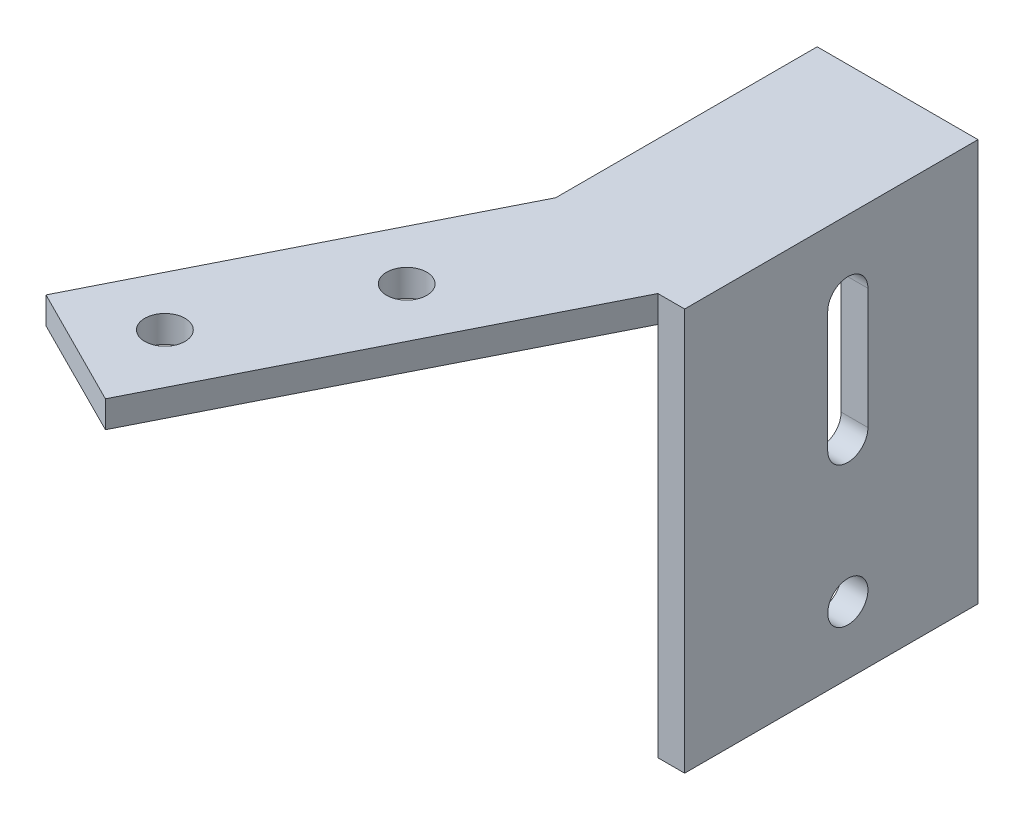
ISO-10303-21;
HEADER;
FILE_DESCRIPTION(('STEP AP214'),'2;1');
FILE_NAME('part.step','',(''),(''),'','','');
FILE_SCHEMA(('AUTOMOTIVE_DESIGN { 1 0 10303 214 1 1 1 1 }'));
ENDSEC;
DATA;
#1=APPLICATION_CONTEXT('core data for automotive mechanical design processes');
#2=APPLICATION_PROTOCOL_DEFINITION('international standard','automotive_design',2000,#1);
#3=PRODUCT_CONTEXT('',#1,'mechanical');
#4=PRODUCT('Part','Part','',(#3));
#5=PRODUCT_RELATED_PRODUCT_CATEGORY('part','',(#4));
#6=PRODUCT_DEFINITION_FORMATION('','',#4);
#7=PRODUCT_DEFINITION_CONTEXT('part definition',#1,'design');
#8=PRODUCT_DEFINITION('design','',#6,#7);
#9=PRODUCT_DEFINITION_SHAPE('','',#8);
#10=(LENGTH_UNIT() NAMED_UNIT(*) SI_UNIT(.MILLI.,.METRE.));
#11=(NAMED_UNIT(*) PLANE_ANGLE_UNIT() SI_UNIT($,.RADIAN.));
#12=(NAMED_UNIT(*) SI_UNIT($,.STERADIAN.) SOLID_ANGLE_UNIT());
#13=UNCERTAINTY_MEASURE_WITH_UNIT(LENGTH_MEASURE(1.E-05),#10,'distance_accuracy_value','');
#14=(GEOMETRIC_REPRESENTATION_CONTEXT(3) GLOBAL_UNCERTAINTY_ASSIGNED_CONTEXT((#13)) GLOBAL_UNIT_ASSIGNED_CONTEXT((#10,
#11,#12)) REPRESENTATION_CONTEXT('',''));
#15=CARTESIAN_POINT('',(0.,0.,0.));
#16=DIRECTION('',(0.,0.,1.));
#17=DIRECTION('',(1.,0.,0.));
#18=AXIS2_PLACEMENT_3D('',#15,#16,#17);
#19=CARTESIAN_POINT('',(-4.43914577172342,2.,-2.23557077949795));
#20=DIRECTION('',(-0.893136002999645,0.,-0.449786705167925));
#21=DIRECTION('',(-0.449786705167925,0.,0.893136002999645));
#22=AXIS2_PLACEMENT_3D('',#19,#20,#21);
#23=PLANE('',#22);
#24=DIRECTION('',(0.449786705167925,0.,-0.893136002999645));
#25=VECTOR('',#24,1.);
#26=CARTESIAN_POINT('',(-4.43914577172342,0.,-2.23557077949795));
#27=LINE('',#26,#25);
#28=CARTESIAN_POINT('',(-12.7192165328537,0.,14.2060652652784));
#29=VERTEX_POINT('',#28);
#30=CARTESIAN_POINT('',(0.0185649749016277,0.,-11.0871929217817));
#31=VERTEX_POINT('',#30);
#32=EDGE_CURVE('E223',#29,#31,#27,.T.);
#33=ORIENTED_EDGE('',*,*,#32,.F.);
#34=DIRECTION('',(0.,-1.,0.));
#35=VECTOR('',#34,1.);
#36=CARTESIAN_POINT('',(-12.7192165328537,2.,14.2060652652784));
#37=LINE('',#36,#35);
#38=CARTESIAN_POINT('',(-12.7192165328537,2.,14.2060652652784));
#39=VERTEX_POINT('',#38);
#40=EDGE_CURVE('E11',#39,#29,#37,.T.);
#41=ORIENTED_EDGE('',*,*,#40,.F.);
#42=DIRECTION('',(0.449786705167925,0.,-0.893136002999645));
#43=VECTOR('',#42,1.);
#44=CARTESIAN_POINT('',(-4.43914577172342,2.,-2.23557077949795));
#45=LINE('',#44,#43);
#46=CARTESIAN_POINT('',(0.0185649749016277,2.,-11.0871929217817));
#47=VERTEX_POINT('',#46);
#48=EDGE_CURVE('E203',#39,#47,#45,.T.);
#49=ORIENTED_EDGE('',*,*,#48,.T.);
#50=DIRECTION('',(0.,-1.,0.));
#51=VECTOR('',#50,1.);
#52=CARTESIAN_POINT('',(0.0185649749016277,2.,-11.0871929217817));
#53=LINE('',#52,#51);
#54=EDGE_CURVE('E217',#47,#31,#53,.T.);
#55=ORIENTED_EDGE('',*,*,#54,.T.);
#56=EDGE_LOOP('',(#33,#41,#49,#55));
#57=FACE_BOUND('',#56,.T.);
#58=ADVANCED_FACE('F37',(#57),#23,.T.);
#59=CARTESIAN_POINT('',(-8.28007076113031,2.,16.4416360447764));
#60=DIRECTION('',(0.449786705167925,0.,-0.893136002999645));
#61=DIRECTION('',(-0.893136002999645,0.,-0.449786705167925));
#62=AXIS2_PLACEMENT_3D('',#59,#60,#61);
#63=PLANE('',#62);
#64=DIRECTION('',(0.893136002999645,0.,0.449786705167925));
#65=VECTOR('',#64,1.);
#66=CARTESIAN_POINT('',(-8.28007076113031,0.,16.4416360447764));
#67=LINE('',#66,#65);
#68=CARTESIAN_POINT('',(-3.78785650285728,0.,18.7039323169577));
#69=VERTEX_POINT('',#68);
#70=EDGE_CURVE('E226',#29,#69,#67,.T.);
#71=ORIENTED_EDGE('',*,*,#70,.T.);
#72=DIRECTION('',(0.,-1.,0.));
#73=VECTOR('',#72,1.);
#74=CARTESIAN_POINT('',(-3.78785650285728,2.,18.7039323169577));
#75=LINE('',#74,#73);
#76=CARTESIAN_POINT('',(-3.78785650285728,2.,18.7039323169577));
#77=VERTEX_POINT('',#76);
#78=EDGE_CURVE('E45',#77,#69,#75,.T.);
#79=ORIENTED_EDGE('',*,*,#78,.F.);
#80=DIRECTION('',(0.893136002999645,0.,0.449786705167925));
#81=VECTOR('',#80,1.);
#82=CARTESIAN_POINT('',(-8.28007076113031,2.,16.4416360447764));
#83=LINE('',#82,#81);
#84=EDGE_CURVE('E206',#39,#77,#83,.T.);
#85=ORIENTED_EDGE('',*,*,#84,.F.);
#86=ORIENTED_EDGE('',*,*,#40,.T.);
#87=EDGE_LOOP('',(#71,#79,#85,#86));
#88=FACE_BOUND('',#87,.T.);
#89=ADVANCED_FACE('F253',(#88),#63,.F.);
#90=CARTESIAN_POINT('',(4.49221425827303,2.,2.26229627218129));
#91=DIRECTION('',(-0.893136002999645,0.,-0.449786705167925));
#92=DIRECTION('',(-0.449786705167925,0.,0.893136002999645));
#93=AXIS2_PLACEMENT_3D('',#90,#91,#92);
#94=PLANE('',#93);
#95=DIRECTION('',(0.449786705167925,0.,-0.893136002999645));
#96=VECTOR('',#95,1.);
#97=CARTESIAN_POINT('',(4.49221425827303,0.,2.26229627218129));
#98=LINE('',#97,#96);
#99=CARTESIAN_POINT('',(10.0185649749016,0.,-8.71131129227785));
#100=VERTEX_POINT('',#99);
#101=EDGE_CURVE('E229',#69,#100,#98,.T.);
#102=ORIENTED_EDGE('',*,*,#101,.T.);
#103=DIRECTION('',(0.,-1.,0.));
#104=VECTOR('',#103,1.);
#105=CARTESIAN_POINT('',(10.0185649749016,2.,-8.71131129227785));
#106=LINE('',#105,#104);
#107=CARTESIAN_POINT('',(10.0185649749016,2.,-8.71131129227785));
#108=VERTEX_POINT('',#107);
#109=EDGE_CURVE('E243',#108,#100,#106,.T.);
#110=ORIENTED_EDGE('',*,*,#109,.F.);
#111=DIRECTION('',(0.449786705167925,0.,-0.893136002999645));
#112=VECTOR('',#111,1.);
#113=CARTESIAN_POINT('',(4.49221425827303,2.,2.26229627218129));
#114=LINE('',#113,#112);
#115=EDGE_CURVE('E209',#77,#108,#114,.T.);
#116=ORIENTED_EDGE('',*,*,#115,.F.);
#117=ORIENTED_EDGE('',*,*,#78,.T.);
#118=EDGE_LOOP('',(#102,#110,#116,#117));
#119=FACE_BOUND('',#118,.T.);
#120=ADVANCED_FACE('F248',(#119),#94,.F.);
#121=CARTESIAN_POINT('',(0.,2.,-30.6));
#122=DIRECTION('',(0.,0.,-1.));
#123=DIRECTION('',(-1.,0.,0.));
#124=AXIS2_PLACEMENT_3D('',#121,#122,#123);
#125=PLANE('',#124);
#126=DIRECTION('',(1.,0.,0.));
#127=VECTOR('',#126,1.);
#128=CARTESIAN_POINT('',(0.,0.,-30.6));
#129=LINE('',#128,#127);
#130=CARTESIAN_POINT('',(0.0185649749016303,0.,-30.6));
#131=VERTEX_POINT('',#130);
#132=CARTESIAN_POINT('',(10.0185649749016,0.,-30.6));
#133=VERTEX_POINT('',#132);
#134=EDGE_CURVE('E235',#131,#133,#129,.T.);
#135=ORIENTED_EDGE('',*,*,#134,.F.);
#136=DIRECTION('',(0.,-1.,0.));
#137=VECTOR('',#136,1.);
#138=CARTESIAN_POINT('',(0.0185649749016303,2.,-30.6));
#139=LINE('',#138,#137);
#140=CARTESIAN_POINT('',(0.0185649749016303,2.,-30.6));
#141=VERTEX_POINT('',#140);
#142=EDGE_CURVE('E241',#141,#131,#139,.T.);
#143=ORIENTED_EDGE('',*,*,#142,.F.);
#144=DIRECTION('',(1.,0.,0.));
#145=VECTOR('',#144,1.);
#146=CARTESIAN_POINT('',(0.,2.,-30.6));
#147=LINE('',#146,#145);
#148=CARTESIAN_POINT('',(12.0185649749016,2.,-30.6));
#149=VERTEX_POINT('',#148);
#150=EDGE_CURVE('E212',#141,#149,#147,.T.);
#151=ORIENTED_EDGE('',*,*,#150,.T.);
#152=DIRECTION('',(0.,1.,0.));
#153=VECTOR('',#152,1.);
#154=CARTESIAN_POINT('',(12.0185649749016,-28.,-30.6));
#155=LINE('',#154,#153);
#156=CARTESIAN_POINT('',(12.0185649749016,-28.,-30.6));
#157=VERTEX_POINT('',#156);
#158=EDGE_CURVE('E190',#157,#149,#155,.T.);
#159=ORIENTED_EDGE('',*,*,#158,.F.);
#160=DIRECTION('',(-1.,0.,0.));
#161=VECTOR('',#160,1.);
#162=CARTESIAN_POINT('',(10.0185649749016,-28.,-30.6));
#163=LINE('',#162,#161);
#164=CARTESIAN_POINT('',(10.0185649749016,-28.,-30.6));
#165=VERTEX_POINT('',#164);
#166=EDGE_CURVE('E178',#157,#165,#163,.T.);
#167=ORIENTED_EDGE('',*,*,#166,.T.);
#168=DIRECTION('',(0.,1.,0.));
#169=VECTOR('',#168,1.);
#170=CARTESIAN_POINT('',(10.0185649749016,-28.,-30.6));
#171=LINE('',#170,#169);
#172=EDGE_CURVE('E186',#165,#133,#171,.T.);
#173=ORIENTED_EDGE('',*,*,#172,.T.);
#174=EDGE_LOOP('',(#135,#143,#151,#159,#167,#173));
#175=FACE_BOUND('',#174,.T.);
#176=ADVANCED_FACE('F265',(#175),#125,.T.);
#177=CARTESIAN_POINT('',(-6.02468089570206,2.,12.0291872258558));
#178=DIRECTION('',(0.,-1.,0.));
#179=DIRECTION('',(0.,0.,-1.));
#180=AXIS2_PLACEMENT_3D('',#177,#178,#179);
#181=CYLINDRICAL_SURFACE('',#180,1.5);
#182=CARTESIAN_POINT('',(-6.02468089570206,2.,12.0291872258558));
#183=DIRECTION('',(0.,1.,0.));
#184=DIRECTION('',(0.,0.,1.));
#185=AXIS2_PLACEMENT_3D('',#182,#183,#184);
#186=CIRCLE('',#185,1.5);
#187=CARTESIAN_POINT('',(-6.02468089570206,2.,13.5291872258558));
#188=VERTEX_POINT('',#187);
#189=EDGE_CURVE('E199',#188,#188,#186,.T.);
#190=ORIENTED_EDGE('',*,*,#189,.T.);
#191=EDGE_LOOP('',(#190));
#192=FACE_BOUND('',#191,.T.);
#193=CARTESIAN_POINT('',(-6.02468089570206,0.,12.0291872258558));
#194=DIRECTION('',(0.,1.,0.));
#195=DIRECTION('',(0.,0.,1.));
#196=AXIS2_PLACEMENT_3D('',#193,#194,#195);
#197=CIRCLE('',#196,1.5);
#198=CARTESIAN_POINT('',(-6.02468089570206,0.,13.5291872258558));
#199=VERTEX_POINT('',#198);
#200=EDGE_CURVE('E220',#199,#199,#197,.T.);
#201=ORIENTED_EDGE('',*,*,#200,.F.);
#202=EDGE_LOOP('',(#201));
#203=FACE_BOUND('',#202,.T.);
#204=ADVANCED_FACE('F299',(#192,#203),#181,.F.);
#205=CARTESIAN_POINT('',(0.0185649749016302,2.,0.0291872258557761));
#206=DIRECTION('',(0.,-1.,0.));
#207=DIRECTION('',(0.,0.,-1.));
#208=AXIS2_PLACEMENT_3D('',#205,#206,#207);
#209=CYLINDRICAL_SURFACE('',#208,1.5);
#210=CARTESIAN_POINT('',(0.0185649749016302,2.,0.0291872258557761));
#211=DIRECTION('',(0.,1.,0.));
#212=DIRECTION('',(0.,0.,1.));
#213=AXIS2_PLACEMENT_3D('',#210,#211,#212);
#214=CIRCLE('',#213,1.5);
#215=CARTESIAN_POINT('',(0.0185649749016302,2.,1.52918722585578));
#216=VERTEX_POINT('',#215);
#217=EDGE_CURVE('E196',#216,#216,#214,.T.);
#218=ORIENTED_EDGE('',*,*,#217,.T.);
#219=EDGE_LOOP('',(#218));
#220=FACE_BOUND('',#219,.T.);
#221=CARTESIAN_POINT('',(0.0185649749016302,0.,0.0291872258557761));
#222=DIRECTION('',(0.,1.,0.));
#223=DIRECTION('',(0.,0.,1.));
#224=AXIS2_PLACEMENT_3D('',#221,#222,#223);
#225=CIRCLE('',#224,1.5);
#226=CARTESIAN_POINT('',(0.0185649749016302,0.,1.52918722585578));
#227=VERTEX_POINT('',#226);
#228=EDGE_CURVE('E189',#227,#227,#225,.T.);
#229=ORIENTED_EDGE('',*,*,#228,.F.);
#230=EDGE_LOOP('',(#229));
#231=FACE_BOUND('',#230,.T.);
#232=ADVANCED_FACE('F39',(#220,#231),#209,.F.);
#233=CARTESIAN_POINT('',(0.0185649749016302,2.,0.));
#234=DIRECTION('',(-1.,0.,0.));
#235=DIRECTION('',(0.,0.,1.));
#236=AXIS2_PLACEMENT_3D('',#233,#234,#235);
#237=PLANE('',#236);
#238=DIRECTION('',(0.,0.,-1.));
#239=VECTOR('',#238,1.);
#240=CARTESIAN_POINT('',(0.0185649749016302,0.,0.));
#241=LINE('',#240,#239);
#242=EDGE_CURVE('E200',#31,#131,#241,.T.);
#243=ORIENTED_EDGE('',*,*,#242,.F.);
#244=ORIENTED_EDGE('',*,*,#54,.F.);
#245=DIRECTION('',(0.,0.,-1.));
#246=VECTOR('',#245,1.);
#247=CARTESIAN_POINT('',(0.0185649749016302,2.,0.));
#248=LINE('',#247,#246);
#249=EDGE_CURVE('E214',#47,#141,#248,.T.);
#250=ORIENTED_EDGE('',*,*,#249,.T.);
#251=ORIENTED_EDGE('',*,*,#142,.T.);
#252=EDGE_LOOP('',(#243,#244,#250,#251));
#253=FACE_BOUND('',#252,.T.);
#254=ADVANCED_FACE('F262',(#253),#237,.T.);
#255=CARTESIAN_POINT('',(0.,2.,0.));
#256=DIRECTION('',(0.,1.,0.));
#257=DIRECTION('',(0.,0.,1.));
#258=AXIS2_PLACEMENT_3D('',#255,#256,#257);
#259=PLANE('',#258);
#260=ORIENTED_EDGE('',*,*,#217,.F.);
#261=EDGE_LOOP('',(#260));
#262=FACE_BOUND('',#261,.T.);
#263=ORIENTED_EDGE('',*,*,#189,.F.);
#264=EDGE_LOOP('',(#263));
#265=FACE_BOUND('',#264,.T.);
#266=ORIENTED_EDGE('',*,*,#48,.F.);
#267=ORIENTED_EDGE('',*,*,#84,.T.);
#268=ORIENTED_EDGE('',*,*,#115,.T.);
#269=DIRECTION('',(1.,0.,0.));
#270=VECTOR('',#269,1.);
#271=CARTESIAN_POINT('',(12.0185649749016,2.,-8.71131129227785));
#272=LINE('',#271,#270);
#273=CARTESIAN_POINT('',(12.0185649749016,2.,-8.71131129227785));
#274=VERTEX_POINT('',#273);
#275=EDGE_CURVE('E167',#108,#274,#272,.T.);
#276=ORIENTED_EDGE('',*,*,#275,.T.);
#277=DIRECTION('',(0.,0.,-1.));
#278=VECTOR('',#277,1.);
#279=CARTESIAN_POINT('',(12.0185649749016,2.,-30.6));
#280=LINE('',#279,#278);
#281=EDGE_CURVE('E172',#274,#149,#280,.T.);
#282=ORIENTED_EDGE('',*,*,#281,.T.);
#283=ORIENTED_EDGE('',*,*,#150,.F.);
#284=ORIENTED_EDGE('',*,*,#249,.F.);
#285=EDGE_LOOP('',(#266,#267,#268,#276,#282,#283,#284));
#286=FACE_BOUND('',#285,.T.);
#287=ADVANCED_FACE('F279',(#262,#265,#286),#259,.T.);
#288=CARTESIAN_POINT('',(0.,0.,0.));
#289=DIRECTION('',(0.,1.,0.));
#290=DIRECTION('',(0.,0.,1.));
#291=AXIS2_PLACEMENT_3D('',#288,#289,#290);
#292=PLANE('',#291);
#293=ORIENTED_EDGE('',*,*,#228,.T.);
#294=EDGE_LOOP('',(#293));
#295=FACE_BOUND('',#294,.T.);
#296=ORIENTED_EDGE('',*,*,#200,.T.);
#297=EDGE_LOOP('',(#296));
#298=FACE_BOUND('',#297,.T.);
#299=ORIENTED_EDGE('',*,*,#32,.T.);
#300=ORIENTED_EDGE('',*,*,#242,.T.);
#301=ORIENTED_EDGE('',*,*,#134,.T.);
#302=DIRECTION('',(0.,0.,1.));
#303=VECTOR('',#302,1.);
#304=CARTESIAN_POINT('',(10.0185649749016,0.,0.));
#305=LINE('',#304,#303);
#306=EDGE_CURVE('E232',#133,#100,#305,.T.);
#307=ORIENTED_EDGE('',*,*,#306,.T.);
#308=ORIENTED_EDGE('',*,*,#101,.F.);
#309=ORIENTED_EDGE('',*,*,#70,.F.);
#310=EDGE_LOOP('',(#299,#300,#301,#307,#308,#309));
#311=FACE_BOUND('',#310,.T.);
#312=ADVANCED_FACE('F256',(#295,#298,#311),#292,.F.);
#313=CARTESIAN_POINT('',(10.0185649749016,-28.,-30.6));
#314=DIRECTION('',(-1.,0.,0.));
#315=DIRECTION('',(0.,0.,1.));
#316=AXIS2_PLACEMENT_3D('',#313,#314,#315);
#317=PLANE('',#316);
#318=CARTESIAN_POINT('',(10.0185649749016,-23.,-20.886224340876));
#319=DIRECTION('',(-1.,0.,0.));
#320=DIRECTION('',(0.,0.,1.));
#321=AXIS2_PLACEMENT_3D('',#318,#319,#320);
#322=CIRCLE('',#321,1.5);
#323=CARTESIAN_POINT('',(10.0185649749016,-23.,-19.386224340876));
#324=VERTEX_POINT('',#323);
#325=EDGE_CURVE('E164',#324,#324,#322,.T.);
#326=ORIENTED_EDGE('',*,*,#325,.F.);
#327=EDGE_LOOP('',(#326));
#328=FACE_BOUND('',#327,.T.);
#329=CARTESIAN_POINT('',(10.0185649749016,-3.5,-20.886224340876));
#330=DIRECTION('',(-1.,0.,0.));
#331=DIRECTION('',(0.,0.,1.));
#332=AXIS2_PLACEMENT_3D('',#329,#330,#331);
#333=CIRCLE('',#332,1.5);
#334=CARTESIAN_POINT('',(10.0185649749016,-3.5,-19.386224340876));
#335=VERTEX_POINT('',#334);
#336=CARTESIAN_POINT('',(10.0185649749016,-3.5,-22.386224340876));
#337=VERTEX_POINT('',#336);
#338=EDGE_CURVE('E162',#335,#337,#333,.T.);
#339=ORIENTED_EDGE('',*,*,#338,.F.);
#340=DIRECTION('',(0.,1.,0.));
#341=VECTOR('',#340,1.);
#342=CARTESIAN_POINT('',(10.0185649749016,-28.,-19.386224340876));
#343=LINE('',#342,#341);
#344=CARTESIAN_POINT('',(10.0185649749016,-12.5,-19.386224340876));
#345=VERTEX_POINT('',#344);
#346=EDGE_CURVE('E157',#345,#335,#343,.T.);
#347=ORIENTED_EDGE('',*,*,#346,.F.);
#348=CARTESIAN_POINT('',(10.0185649749016,-12.5,-20.886224340876));
#349=DIRECTION('',(-1.,0.,0.));
#350=DIRECTION('',(0.,0.,1.));
#351=AXIS2_PLACEMENT_3D('',#348,#349,#350);
#352=CIRCLE('',#351,1.5);
#353=CARTESIAN_POINT('',(10.0185649749016,-12.5,-22.386224340876));
#354=VERTEX_POINT('',#353);
#355=EDGE_CURVE('E134',#354,#345,#352,.T.);
#356=ORIENTED_EDGE('',*,*,#355,.F.);
#357=DIRECTION('',(0.,-1.,0.));
#358=VECTOR('',#357,1.);
#359=CARTESIAN_POINT('',(10.0185649749016,-28.,-22.386224340876));
#360=LINE('',#359,#358);
#361=EDGE_CURVE('E160',#337,#354,#360,.T.);
#362=ORIENTED_EDGE('',*,*,#361,.F.);
#363=EDGE_LOOP('',(#339,#347,#356,#362));
#364=FACE_BOUND('',#363,.T.);
#365=ORIENTED_EDGE('',*,*,#306,.F.);
#366=ORIENTED_EDGE('',*,*,#172,.F.);
#367=DIRECTION('',(0.,0.,1.));
#368=VECTOR('',#367,1.);
#369=CARTESIAN_POINT('',(10.0185649749016,-28.,-30.6));
#370=LINE('',#369,#368);
#371=CARTESIAN_POINT('',(10.0185649749016,-28.,-8.71131129227785));
#372=VERTEX_POINT('',#371);
#373=EDGE_CURVE('E168',#165,#372,#370,.T.);
#374=ORIENTED_EDGE('',*,*,#373,.T.);
#375=DIRECTION('',(0.,1.,0.));
#376=VECTOR('',#375,1.);
#377=CARTESIAN_POINT('',(10.0185649749016,-28.,-8.71131129227785));
#378=LINE('',#377,#376);
#379=EDGE_CURVE('E181',#372,#100,#378,.T.);
#380=ORIENTED_EDGE('',*,*,#379,.T.);
#381=EDGE_LOOP('',(#365,#366,#374,#380));
#382=FACE_BOUND('',#381,.T.);
#383=ADVANCED_FACE('F270',(#328,#364,#382),#317,.T.);
#384=CARTESIAN_POINT('',(12.0185649749016,-28.,-30.6));
#385=DIRECTION('',(1.,0.,0.));
#386=DIRECTION('',(0.,0.,-1.));
#387=AXIS2_PLACEMENT_3D('',#384,#385,#386);
#388=PLANE('',#387);
#389=CARTESIAN_POINT('',(12.0185649749016,-23.,-20.886224340876));
#390=DIRECTION('',(1.,0.,0.));
#391=DIRECTION('',(0.,0.,-1.));
#392=AXIS2_PLACEMENT_3D('',#389,#390,#391);
#393=CIRCLE('',#392,1.5);
#394=CARTESIAN_POINT('',(12.0185649749016,-23.,-22.386224340876));
#395=VERTEX_POINT('',#394);
#396=EDGE_CURVE('E154',#395,#395,#393,.T.);
#397=ORIENTED_EDGE('',*,*,#396,.F.);
#398=EDGE_LOOP('',(#397));
#399=FACE_BOUND('',#398,.T.);
#400=CARTESIAN_POINT('',(12.0185649749016,-3.5,-20.886224340876));
#401=DIRECTION('',(1.,0.,0.));
#402=DIRECTION('',(0.,0.,-1.));
#403=AXIS2_PLACEMENT_3D('',#400,#401,#402);
#404=CIRCLE('',#403,1.5);
#405=CARTESIAN_POINT('',(12.0185649749016,-3.5,-22.386224340876));
#406=VERTEX_POINT('',#405);
#407=CARTESIAN_POINT('',(12.0185649749016,-3.5,-19.386224340876));
#408=VERTEX_POINT('',#407);
#409=EDGE_CURVE('E60',#406,#408,#404,.T.);
#410=ORIENTED_EDGE('',*,*,#409,.F.);
#411=DIRECTION('',(0.,1.,0.));
#412=VECTOR('',#411,1.);
#413=CARTESIAN_POINT('',(12.0185649749016,-3.5,-22.386224340876));
#414=LINE('',#413,#412);
#415=CARTESIAN_POINT('',(12.0185649749016,-12.5,-22.386224340876));
#416=VERTEX_POINT('',#415);
#417=EDGE_CURVE('E147',#416,#406,#414,.T.);
#418=ORIENTED_EDGE('',*,*,#417,.F.);
#419=CARTESIAN_POINT('',(12.0185649749016,-12.5,-20.886224340876));
#420=DIRECTION('',(1.,0.,0.));
#421=DIRECTION('',(0.,0.,-1.));
#422=AXIS2_PLACEMENT_3D('',#419,#420,#421);
#423=CIRCLE('',#422,1.5);
#424=CARTESIAN_POINT('',(12.0185649749016,-12.5,-19.386224340876));
#425=VERTEX_POINT('',#424);
#426=EDGE_CURVE('E131',#425,#416,#423,.T.);
#427=ORIENTED_EDGE('',*,*,#426,.F.);
#428=DIRECTION('',(0.,-1.,0.));
#429=VECTOR('',#428,1.);
#430=CARTESIAN_POINT('',(12.0185649749016,-3.5,-19.386224340876));
#431=LINE('',#430,#429);
#432=EDGE_CURVE('E140',#408,#425,#431,.T.);
#433=ORIENTED_EDGE('',*,*,#432,.F.);
#434=EDGE_LOOP('',(#410,#418,#427,#433));
#435=FACE_BOUND('',#434,.T.);
#436=ORIENTED_EDGE('',*,*,#281,.F.);
#437=DIRECTION('',(0.,1.,0.));
#438=VECTOR('',#437,1.);
#439=CARTESIAN_POINT('',(12.0185649749016,-28.,-8.71131129227785));
#440=LINE('',#439,#438);
#441=CARTESIAN_POINT('',(12.0185649749016,-28.,-8.71131129227785));
#442=VERTEX_POINT('',#441);
#443=EDGE_CURVE('E193',#442,#274,#440,.T.);
#444=ORIENTED_EDGE('',*,*,#443,.F.);
#445=DIRECTION('',(0.,0.,-1.));
#446=VECTOR('',#445,1.);
#447=CARTESIAN_POINT('',(12.0185649749016,-28.,-30.6));
#448=LINE('',#447,#446);
#449=EDGE_CURVE('E175',#442,#157,#448,.T.);
#450=ORIENTED_EDGE('',*,*,#449,.T.);
#451=ORIENTED_EDGE('',*,*,#158,.T.);
#452=EDGE_LOOP('',(#436,#444,#450,#451));
#453=FACE_BOUND('',#452,.T.);
#454=ADVANCED_FACE('F144',(#399,#435,#453),#388,.T.);
#455=CARTESIAN_POINT('',(12.0185649749016,-28.,-8.71131129227785));
#456=DIRECTION('',(0.,0.,1.));
#457=DIRECTION('',(1.,0.,0.));
#458=AXIS2_PLACEMENT_3D('',#455,#456,#457);
#459=PLANE('',#458);
#460=ORIENTED_EDGE('',*,*,#275,.F.);
#461=ORIENTED_EDGE('',*,*,#109,.T.);
#462=ORIENTED_EDGE('',*,*,#379,.F.);
#463=DIRECTION('',(1.,0.,0.));
#464=VECTOR('',#463,1.);
#465=CARTESIAN_POINT('',(12.0185649749016,-28.,-8.71131129227785));
#466=LINE('',#465,#464);
#467=EDGE_CURVE('E171',#372,#442,#466,.T.);
#468=ORIENTED_EDGE('',*,*,#467,.T.);
#469=ORIENTED_EDGE('',*,*,#443,.T.);
#470=EDGE_LOOP('',(#460,#461,#462,#468,#469));
#471=FACE_BOUND('',#470,.T.);
#472=ADVANCED_FACE('F276',(#471),#459,.T.);
#473=CARTESIAN_POINT('',(0.,-28.,0.));
#474=DIRECTION('',(0.,-1.,0.));
#475=DIRECTION('',(0.,0.,-1.));
#476=AXIS2_PLACEMENT_3D('',#473,#474,#475);
#477=PLANE('',#476);
#478=ORIENTED_EDGE('',*,*,#373,.F.);
#479=ORIENTED_EDGE('',*,*,#166,.F.);
#480=ORIENTED_EDGE('',*,*,#449,.F.);
#481=ORIENTED_EDGE('',*,*,#467,.F.);
#482=EDGE_LOOP('',(#478,#479,#480,#481));
#483=FACE_BOUND('',#482,.T.);
#484=ADVANCED_FACE('F273',(#483),#477,.T.);
#485=CARTESIAN_POINT('',(-17.9814350250984,-3.5,-20.886224340876));
#486=DIRECTION('',(1.,0.,0.));
#487=DIRECTION('',(0.,0.,-1.));
#488=AXIS2_PLACEMENT_3D('',#485,#486,#487);
#489=CYLINDRICAL_SURFACE('',#488,1.5);
#490=ORIENTED_EDGE('',*,*,#338,.T.);
#491=DIRECTION('',(1.,0.,0.));
#492=VECTOR('',#491,1.);
#493=CARTESIAN_POINT('',(-17.9814350250984,-3.5,-22.386224340876));
#494=LINE('',#493,#492);
#495=EDGE_CURVE('E152',#337,#406,#494,.T.);
#496=ORIENTED_EDGE('',*,*,#495,.T.);
#497=ORIENTED_EDGE('',*,*,#409,.T.);
#498=DIRECTION('',(1.,0.,0.));
#499=VECTOR('',#498,1.);
#500=CARTESIAN_POINT('',(-17.9814350250984,-3.5,-19.386224340876));
#501=LINE('',#500,#499);
#502=EDGE_CURVE('E137',#335,#408,#501,.T.);
#503=ORIENTED_EDGE('',*,*,#502,.F.);
#504=EDGE_LOOP('',(#490,#496,#497,#503));
#505=FACE_BOUND('',#504,.T.);
#506=ADVANCED_FACE('F361',(#505),#489,.F.);
#507=CARTESIAN_POINT('',(-17.9814350250984,-3.5,-22.386224340876));
#508=DIRECTION('',(0.,0.,-1.));
#509=DIRECTION('',(-1.,0.,0.));
#510=AXIS2_PLACEMENT_3D('',#507,#508,#509);
#511=PLANE('',#510);
#512=ORIENTED_EDGE('',*,*,#361,.T.);
#513=DIRECTION('',(1.,0.,0.));
#514=VECTOR('',#513,1.);
#515=CARTESIAN_POINT('',(-17.9814350250984,-12.5,-22.386224340876));
#516=LINE('',#515,#514);
#517=EDGE_CURVE('E136',#354,#416,#516,.T.);
#518=ORIENTED_EDGE('',*,*,#517,.T.);
#519=ORIENTED_EDGE('',*,*,#417,.T.);
#520=ORIENTED_EDGE('',*,*,#495,.F.);
#521=EDGE_LOOP('',(#512,#518,#519,#520));
#522=FACE_BOUND('',#521,.T.);
#523=ADVANCED_FACE('F377',(#522),#511,.F.);
#524=CARTESIAN_POINT('',(-17.9814350250984,-12.5,-20.886224340876));
#525=DIRECTION('',(1.,0.,0.));
#526=DIRECTION('',(0.,0.,-1.));
#527=AXIS2_PLACEMENT_3D('',#524,#525,#526);
#528=CYLINDRICAL_SURFACE('',#527,1.5);
#529=ORIENTED_EDGE('',*,*,#355,.T.);
#530=DIRECTION('',(1.,0.,0.));
#531=VECTOR('',#530,1.);
#532=CARTESIAN_POINT('',(-17.9814350250984,-12.5,-19.386224340876));
#533=LINE('',#532,#531);
#534=EDGE_CURVE('E52',#345,#425,#533,.T.);
#535=ORIENTED_EDGE('',*,*,#534,.T.);
#536=ORIENTED_EDGE('',*,*,#426,.T.);
#537=ORIENTED_EDGE('',*,*,#517,.F.);
#538=EDGE_LOOP('',(#529,#535,#536,#537));
#539=FACE_BOUND('',#538,.T.);
#540=ADVANCED_FACE('F128',(#539),#528,.F.);
#541=CARTESIAN_POINT('',(-17.9814350250984,-3.5,-19.386224340876));
#542=DIRECTION('',(0.,0.,1.));
#543=DIRECTION('',(1.,0.,0.));
#544=AXIS2_PLACEMENT_3D('',#541,#542,#543);
#545=PLANE('',#544);
#546=ORIENTED_EDGE('',*,*,#346,.T.);
#547=ORIENTED_EDGE('',*,*,#502,.T.);
#548=ORIENTED_EDGE('',*,*,#432,.T.);
#549=ORIENTED_EDGE('',*,*,#534,.F.);
#550=EDGE_LOOP('',(#546,#547,#548,#549));
#551=FACE_BOUND('',#550,.T.);
#552=ADVANCED_FACE('F141',(#551),#545,.F.);
#553=CARTESIAN_POINT('',(-17.9814350250984,-23.,-20.886224340876));
#554=DIRECTION('',(1.,0.,0.));
#555=DIRECTION('',(0.,0.,-1.));
#556=AXIS2_PLACEMENT_3D('',#553,#554,#555);
#557=CYLINDRICAL_SURFACE('',#556,1.5);
#558=ORIENTED_EDGE('',*,*,#325,.T.);
#559=EDGE_LOOP('',(#558));
#560=FACE_BOUND('',#559,.T.);
#561=ORIENTED_EDGE('',*,*,#396,.T.);
#562=EDGE_LOOP('',(#561));
#563=FACE_BOUND('',#562,.T.);
#564=ADVANCED_FACE('F403',(#560,#563),#557,.F.);
#565=CLOSED_SHELL('',(#58,#89,#120,#176,#204,#232,#254,#287,#312,#383,#454,#472,#484,#506,#523,
#540,#552,#564));
#566=MANIFOLD_SOLID_BREP('B2',#565);
#567=ADVANCED_BREP_SHAPE_REPRESENTATION('',(#18,#566),#14);
#568=SHAPE_DEFINITION_REPRESENTATION(#9,#567);
ENDSEC;
END-ISO-10303-21;
